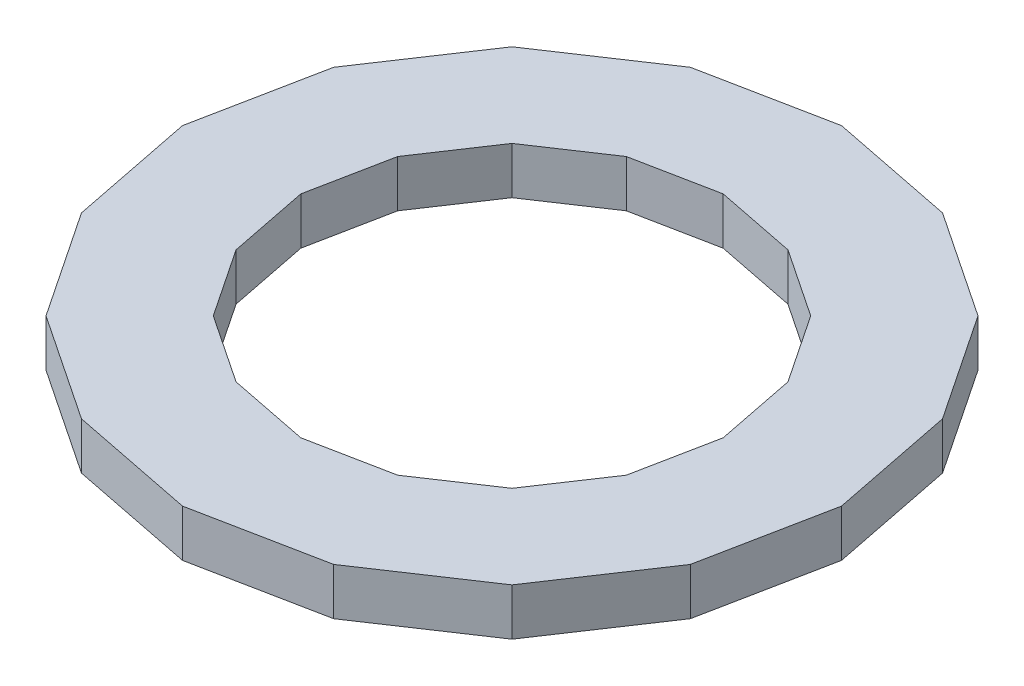
ISO-10303-21;
HEADER;
FILE_DESCRIPTION(('STEP AP214'),'2;1');
FILE_NAME('part.step','',(''),(''),'','','');
FILE_SCHEMA(('AUTOMOTIVE_DESIGN { 1 0 10303 214 1 1 1 1 }'));
ENDSEC;
DATA;
#1=APPLICATION_CONTEXT('core data for automotive mechanical design processes');
#2=APPLICATION_PROTOCOL_DEFINITION('international standard','automotive_design',2000,#1);
#3=PRODUCT_CONTEXT('',#1,'mechanical');
#4=PRODUCT('Part','Part','',(#3));
#5=PRODUCT_RELATED_PRODUCT_CATEGORY('part','',(#4));
#6=PRODUCT_DEFINITION_FORMATION('','',#4);
#7=PRODUCT_DEFINITION_CONTEXT('part definition',#1,'design');
#8=PRODUCT_DEFINITION('design','',#6,#7);
#9=PRODUCT_DEFINITION_SHAPE('','',#8);
#10=(LENGTH_UNIT() NAMED_UNIT(*) SI_UNIT(.MILLI.,.METRE.));
#11=(NAMED_UNIT(*) PLANE_ANGLE_UNIT() SI_UNIT($,.RADIAN.));
#12=(NAMED_UNIT(*) SI_UNIT($,.STERADIAN.) SOLID_ANGLE_UNIT());
#13=UNCERTAINTY_MEASURE_WITH_UNIT(LENGTH_MEASURE(1.E-05),#10,'distance_accuracy_value','');
#14=(GEOMETRIC_REPRESENTATION_CONTEXT(3) GLOBAL_UNCERTAINTY_ASSIGNED_CONTEXT((#13)) GLOBAL_UNIT_ASSIGNED_CONTEXT((#10,
#11,#12)) REPRESENTATION_CONTEXT('',''));
#15=CARTESIAN_POINT('',(0.,0.,0.));
#16=DIRECTION('',(0.,0.,1.));
#17=DIRECTION('',(1.,0.,0.));
#18=AXIS2_PLACEMENT_3D('',#15,#16,#17);
#19=CARTESIAN_POINT('',(0.,19.05,0.));
#20=DIRECTION('',(0.,1.,0.));
#21=DIRECTION('',(0.,0.,1.));
#22=AXIS2_PLACEMENT_3D('',#19,#20,#21);
#23=PLANE('',#22);
#24=DIRECTION('',(0.195090322016117,0.,-0.980785280403233));
#25=VECTOR('',#24,1.);
#26=CARTESIAN_POINT('',(123.292654296521,19.05,51.0694895505946));
#27=LINE('',#26,#25);
#28=CARTESIAN_POINT('',(123.292654296521,19.05,51.0694895505946));
#29=VERTEX_POINT('',#28);
#30=CARTESIAN_POINT('',(133.4510073639,19.05,-1.48838792591941E-12));
#31=VERTEX_POINT('',#30);
#32=EDGE_CURVE('E372',#29,#31,#27,.T.);
#33=ORIENTED_EDGE('',*,*,#32,.T.);
#34=DIRECTION('',(-0.19509032201614,0.,-0.980785280403228));
#35=VECTOR('',#34,1.);
#36=CARTESIAN_POINT('',(133.4510073639,19.05,-1.48838792591941E-12));
#37=LINE('',#36,#35);
#38=CARTESIAN_POINT('',(123.29265429652,19.05,-51.0694895505976));
#39=VERTEX_POINT('',#38);
#40=EDGE_CURVE('E375',#31,#39,#37,.T.);
#41=ORIENTED_EDGE('',*,*,#40,.T.);
#42=DIRECTION('',(-0.555570233019612,0.,-0.831469612302539));
#43=VECTOR('',#42,1.);
#44=CARTESIAN_POINT('',(123.29265429652,19.05,-51.0694895505976));
#45=LINE('',#44,#43);
#46=CARTESIAN_POINT('',(94.3641122631884,19.05,-94.3641122631908));
#47=VERTEX_POINT('',#46);
#48=EDGE_CURVE('E379',#39,#47,#45,.T.);
#49=ORIENTED_EDGE('',*,*,#48,.T.);
#50=DIRECTION('',(-0.831469612302552,0.,-0.555570233019592));
#51=VECTOR('',#50,1.);
#52=CARTESIAN_POINT('',(94.3641122631884,19.05,-94.3641122631908));
#53=LINE('',#52,#51);
#54=CARTESIAN_POINT('',(51.0694895505949,19.05,-123.292654296521));
#55=VERTEX_POINT('',#54);
#56=EDGE_CURVE('E382',#47,#55,#53,.T.);
#57=ORIENTED_EDGE('',*,*,#56,.T.);
#58=DIRECTION('',(-0.980785280403233,0.,-0.195090322016117));
#59=VECTOR('',#58,1.);
#60=CARTESIAN_POINT('',(51.0694895505949,19.05,-123.292654296521));
#61=LINE('',#60,#59);
#62=CARTESIAN_POINT('',(-1.63749649234883E-12,19.05,-133.4510073639));
#63=VERTEX_POINT('',#62);
#64=EDGE_CURVE('E384',#55,#63,#61,.T.);
#65=ORIENTED_EDGE('',*,*,#64,.T.);
#66=DIRECTION('',(-0.980785280403228,0.,0.19509032201614));
#67=VECTOR('',#66,1.);
#68=CARTESIAN_POINT('',(-1.63749649234883E-12,19.05,-133.4510073639));
#69=LINE('',#68,#67);
#70=CARTESIAN_POINT('',(-51.0694895505976,19.05,-123.29265429652));
#71=VERTEX_POINT('',#70);
#72=EDGE_CURVE('E386',#63,#71,#69,.T.);
#73=ORIENTED_EDGE('',*,*,#72,.T.);
#74=DIRECTION('',(-0.831469612302539,0.,0.555570233019612));
#75=VECTOR('',#74,1.);
#76=CARTESIAN_POINT('',(-51.0694895505976,19.05,-123.29265429652));
#77=LINE('',#76,#75);
#78=CARTESIAN_POINT('',(-94.3641122631907,19.05,-94.3641122631884));
#79=VERTEX_POINT('',#78);
#80=EDGE_CURVE('E388',#71,#79,#77,.T.);
#81=ORIENTED_EDGE('',*,*,#80,.T.);
#82=DIRECTION('',(-0.555570233019592,0.,0.831469612302552));
#83=VECTOR('',#82,1.);
#84=CARTESIAN_POINT('',(-94.3641122631907,19.05,-94.3641122631884));
#85=LINE('',#84,#83);
#86=CARTESIAN_POINT('',(-123.292654296521,19.05,-51.0694895505946));
#87=VERTEX_POINT('',#86);
#88=EDGE_CURVE('E390',#79,#87,#85,.T.);
#89=ORIENTED_EDGE('',*,*,#88,.T.);
#90=DIRECTION('',(-0.195090322016117,0.,0.980785280403233));
#91=VECTOR('',#90,1.);
#92=CARTESIAN_POINT('',(-123.292654296521,19.05,-51.0694895505946));
#93=LINE('',#92,#91);
#94=CARTESIAN_POINT('',(-133.4510073639,19.05,1.62428577440673E-12));
#95=VERTEX_POINT('',#94);
#96=EDGE_CURVE('E392',#87,#95,#93,.T.);
#97=ORIENTED_EDGE('',*,*,#96,.T.);
#98=DIRECTION('',(0.19509032201614,0.,0.980785280403228));
#99=VECTOR('',#98,1.);
#100=CARTESIAN_POINT('',(-133.4510073639,19.05,1.62428577440673E-12));
#101=LINE('',#100,#99);
#102=CARTESIAN_POINT('',(-123.29265429652,19.05,51.0694895505975));
#103=VERTEX_POINT('',#102);
#104=EDGE_CURVE('E394',#95,#103,#101,.T.);
#105=ORIENTED_EDGE('',*,*,#104,.T.);
#106=DIRECTION('',(0.555570233019612,0.,0.831469612302539));
#107=VECTOR('',#106,1.);
#108=CARTESIAN_POINT('',(-123.29265429652,19.05,51.0694895505975));
#109=LINE('',#108,#107);
#110=CARTESIAN_POINT('',(-94.3641122631884,19.05,94.3641122631907));
#111=VERTEX_POINT('',#110);
#112=EDGE_CURVE('E396',#103,#111,#109,.T.);
#113=ORIENTED_EDGE('',*,*,#112,.T.);
#114=DIRECTION('',(0.831469612302552,0.,0.555570233019592));
#115=VECTOR('',#114,1.);
#116=CARTESIAN_POINT('',(-94.3641122631884,19.05,94.3641122631907));
#117=LINE('',#116,#115);
#118=CARTESIAN_POINT('',(-51.0694895505946,19.05,123.292654296521));
#119=VERTEX_POINT('',#118);
#120=EDGE_CURVE('E398',#111,#119,#117,.T.);
#121=ORIENTED_EDGE('',*,*,#120,.T.);
#122=DIRECTION('',(0.980785280403233,0.,0.195090322016117));
#123=VECTOR('',#122,1.);
#124=CARTESIAN_POINT('',(-51.0694895505946,19.05,123.292654296521));
#125=LINE('',#124,#123);
#126=CARTESIAN_POINT('',(1.51394766675289E-12,19.05,133.4510073639));
#127=VERTEX_POINT('',#126);
#128=EDGE_CURVE('E400',#119,#127,#125,.T.);
#129=ORIENTED_EDGE('',*,*,#128,.T.);
#130=DIRECTION('',(0.980785280403228,0.,-0.19509032201614));
#131=VECTOR('',#130,1.);
#132=CARTESIAN_POINT('',(1.51394766675289E-12,19.05,133.4510073639));
#133=LINE('',#132,#131);
#134=CARTESIAN_POINT('',(51.0694895505976,19.05,123.29265429652));
#135=VERTEX_POINT('',#134);
#136=EDGE_CURVE('E402',#127,#135,#133,.T.);
#137=ORIENTED_EDGE('',*,*,#136,.T.);
#138=DIRECTION('',(0.831469612302539,0.,-0.555570233019612));
#139=VECTOR('',#138,1.);
#140=CARTESIAN_POINT('',(51.0694895505976,19.05,123.29265429652));
#141=LINE('',#140,#139);
#142=CARTESIAN_POINT('',(94.3641122631907,19.05,94.3641122631884));
#143=VERTEX_POINT('',#142);
#144=EDGE_CURVE('E404',#135,#143,#141,.T.);
#145=ORIENTED_EDGE('',*,*,#144,.T.);
#146=DIRECTION('',(0.555570233019593,0.,-0.831469612302552));
#147=VECTOR('',#146,1.);
#148=CARTESIAN_POINT('',(94.3641122631907,19.05,94.3641122631884));
#149=LINE('',#148,#147);
#150=EDGE_CURVE('E407',#143,#29,#149,.T.);
#151=ORIENTED_EDGE('',*,*,#150,.T.);
#152=EDGE_LOOP('',(#33,#41,#49,#57,#65,#73,#81,#89,#97,#105,#113,#121,#129,#137,#145,#151));
#153=FACE_BOUND('',#152,.T.);
#154=DIRECTION('',(-0.19509032201614,0.,-0.980785280403228));
#155=VECTOR('',#154,1.);
#156=CARTESIAN_POINT('',(85.5404188396911,19.05,-1.06158805616335E-12));
#157=LINE('',#156,#155);
#158=CARTESIAN_POINT('',(85.5404188396911,19.05,-1.06158805616335E-12));
#159=VERTEX_POINT('',#158);
#160=CARTESIAN_POINT('',(79.0290421684331,19.05,-32.7349010875213));
#161=VERTEX_POINT('',#160);
#162=EDGE_CURVE('E251',#159,#161,#157,.T.);
#163=ORIENTED_EDGE('',*,*,#162,.F.);
#164=DIRECTION('',(0.195090322016117,0.,-0.980785280403233));
#165=VECTOR('',#164,1.);
#166=CARTESIAN_POINT('',(79.0290421684339,19.05,32.7349010875194));
#167=LINE('',#166,#165);
#168=CARTESIAN_POINT('',(79.0290421684339,19.05,32.7349010875194));
#169=VERTEX_POINT('',#168);
#170=EDGE_CURVE('E243',#169,#159,#167,.T.);
#171=ORIENTED_EDGE('',*,*,#170,.F.);
#172=DIRECTION('',(0.555570233019593,0.,-0.831469612302552));
#173=VECTOR('',#172,1.);
#174=CARTESIAN_POINT('',(60.4862102270838,19.05,60.4862102270824));
#175=LINE('',#174,#173);
#176=CARTESIAN_POINT('',(60.4862102270838,19.05,60.4862102270824));
#177=VERTEX_POINT('',#176);
#178=EDGE_CURVE('E297',#177,#169,#175,.T.);
#179=ORIENTED_EDGE('',*,*,#178,.F.);
#180=DIRECTION('',(0.831469612302539,0.,-0.555570233019612));
#181=VECTOR('',#180,1.);
#182=CARTESIAN_POINT('',(32.7349010875213,19.05,79.0290421684331));
#183=LINE('',#182,#181);
#184=CARTESIAN_POINT('',(32.7349010875213,19.05,79.0290421684331));
#185=VERTEX_POINT('',#184);
#186=EDGE_CURVE('E294',#185,#177,#183,.T.);
#187=ORIENTED_EDGE('',*,*,#186,.F.);
#188=DIRECTION('',(0.980785280403228,0.,-0.19509032201614));
#189=VECTOR('',#188,1.);
#190=CARTESIAN_POINT('',(1.01627863446326E-12,19.05,85.5404188396911));
#191=LINE('',#190,#189);
#192=CARTESIAN_POINT('',(1.01627863446326E-12,19.05,85.5404188396911));
#193=VERTEX_POINT('',#192);
#194=EDGE_CURVE('E292',#193,#185,#191,.T.);
#195=ORIENTED_EDGE('',*,*,#194,.F.);
#196=DIRECTION('',(0.980785280403233,0.,0.195090322016117));
#197=VECTOR('',#196,1.);
#198=CARTESIAN_POINT('',(-32.7349010875195,19.05,79.0290421684338));
#199=LINE('',#198,#197);
#200=CARTESIAN_POINT('',(-32.7349010875195,19.05,79.0290421684338));
#201=VERTEX_POINT('',#200);
#202=EDGE_CURVE('E290',#201,#193,#199,.T.);
#203=ORIENTED_EDGE('',*,*,#202,.F.);
#204=DIRECTION('',(0.831469612302552,0.,0.555570233019593));
#205=VECTOR('',#204,1.);
#206=CARTESIAN_POINT('',(-60.4862102270824,19.05,60.4862102270838));
#207=LINE('',#206,#205);
#208=CARTESIAN_POINT('',(-60.4862102270824,19.05,60.4862102270838));
#209=VERTEX_POINT('',#208);
#210=EDGE_CURVE('E288',#209,#201,#207,.T.);
#211=ORIENTED_EDGE('',*,*,#210,.F.);
#212=DIRECTION('',(0.555570233019612,0.,0.831469612302538));
#213=VECTOR('',#212,1.);
#214=CARTESIAN_POINT('',(-79.0290421684331,19.05,32.7349010875213));
#215=LINE('',#214,#213);
#216=CARTESIAN_POINT('',(-79.0290421684331,19.05,32.7349010875213));
#217=VERTEX_POINT('',#216);
#218=EDGE_CURVE('E286',#217,#209,#215,.T.);
#219=ORIENTED_EDGE('',*,*,#218,.F.);
#220=DIRECTION('',(0.19509032201614,0.,0.980785280403228));
#221=VECTOR('',#220,1.);
#222=CARTESIAN_POINT('',(-85.5404188396911,19.05,1.03311122827834E-12));
#223=LINE('',#222,#221);
#224=CARTESIAN_POINT('',(-85.5404188396911,19.05,1.03311122827834E-12));
#225=VERTEX_POINT('',#224);
#226=EDGE_CURVE('E284',#225,#217,#223,.T.);
#227=ORIENTED_EDGE('',*,*,#226,.F.);
#228=DIRECTION('',(-0.195090322016117,0.,0.980785280403233));
#229=VECTOR('',#228,1.);
#230=CARTESIAN_POINT('',(-79.0290421684339,19.05,-32.7349010875194));
#231=LINE('',#230,#229);
#232=CARTESIAN_POINT('',(-79.0290421684339,19.05,-32.7349010875194));
#233=VERTEX_POINT('',#232);
#234=EDGE_CURVE('E282',#233,#225,#231,.T.);
#235=ORIENTED_EDGE('',*,*,#234,.F.);
#236=DIRECTION('',(-0.555570233019593,0.,0.831469612302552));
#237=VECTOR('',#236,1.);
#238=CARTESIAN_POINT('',(-60.4862102270838,19.05,-60.4862102270823));
#239=LINE('',#238,#237);
#240=CARTESIAN_POINT('',(-60.4862102270838,19.05,-60.4862102270823));
#241=VERTEX_POINT('',#240);
#242=EDGE_CURVE('E280',#241,#233,#239,.T.);
#243=ORIENTED_EDGE('',*,*,#242,.F.);
#244=DIRECTION('',(-0.831469612302539,0.,0.555570233019612));
#245=VECTOR('',#244,1.);
#246=CARTESIAN_POINT('',(-32.7349010875213,19.05,-79.0290421684331));
#247=LINE('',#246,#245);
#248=CARTESIAN_POINT('',(-32.7349010875213,19.05,-79.0290421684331));
#249=VERTEX_POINT('',#248);
#250=EDGE_CURVE('E278',#249,#241,#247,.T.);
#251=ORIENTED_EDGE('',*,*,#250,.F.);
#252=DIRECTION('',(-0.980785280403228,0.,0.19509032201614));
#253=VECTOR('',#252,1.);
#254=CARTESIAN_POINT('',(-1.01279089201621E-12,19.05,-85.5404188396911));
#255=LINE('',#254,#253);
#256=CARTESIAN_POINT('',(-1.01279089201621E-12,19.05,-85.5404188396911));
#257=VERTEX_POINT('',#256);
#258=EDGE_CURVE('E276',#257,#249,#255,.T.);
#259=ORIENTED_EDGE('',*,*,#258,.F.);
#260=DIRECTION('',(-0.980785280403233,0.,-0.195090322016117));
#261=VECTOR('',#260,1.);
#262=CARTESIAN_POINT('',(32.7349010875195,19.05,-79.0290421684338));
#263=LINE('',#262,#261);
#264=CARTESIAN_POINT('',(32.7349010875195,19.05,-79.0290421684338));
#265=VERTEX_POINT('',#264);
#266=EDGE_CURVE('E274',#265,#257,#263,.T.);
#267=ORIENTED_EDGE('',*,*,#266,.F.);
#268=DIRECTION('',(-0.831469612302552,0.,-0.555570233019592));
#269=VECTOR('',#268,1.);
#270=CARTESIAN_POINT('',(60.4862102270824,19.05,-60.4862102270838));
#271=LINE('',#270,#269);
#272=CARTESIAN_POINT('',(60.4862102270824,19.05,-60.4862102270838));
#273=VERTEX_POINT('',#272);
#274=EDGE_CURVE('E270',#273,#265,#271,.T.);
#275=ORIENTED_EDGE('',*,*,#274,.F.);
#276=DIRECTION('',(-0.555570233019612,0.,-0.831469612302539));
#277=VECTOR('',#276,1.);
#278=CARTESIAN_POINT('',(79.0290421684331,19.05,-32.7349010875213));
#279=LINE('',#278,#277);
#280=EDGE_CURVE('E264',#161,#273,#279,.T.);
#281=ORIENTED_EDGE('',*,*,#280,.F.);
#282=EDGE_LOOP('',(#163,#171,#179,#187,#195,#203,#211,#219,#227,#235,#243,#251,#259,#267,#275,#281));
#283=FACE_BOUND('',#282,.T.);
#284=ADVANCED_FACE('F34',(#153,#283),#23,.T.);
#285=CARTESIAN_POINT('',(0.,0.,0.));
#286=DIRECTION('',(0.,1.,0.));
#287=DIRECTION('',(0.,0.,1.));
#288=AXIS2_PLACEMENT_3D('',#285,#286,#287);
#289=PLANE('',#288);
#290=DIRECTION('',(0.195090322016117,0.,-0.980785280403233));
#291=VECTOR('',#290,1.);
#292=CARTESIAN_POINT('',(123.292654296521,0.,51.0694895505946));
#293=LINE('',#292,#291);
#294=CARTESIAN_POINT('',(123.292654296521,0.,51.0694895505946));
#295=VERTEX_POINT('',#294);
#296=CARTESIAN_POINT('',(133.4510073639,0.,-1.48838792591941E-12));
#297=VERTEX_POINT('',#296);
#298=EDGE_CURVE('E259',#295,#297,#293,.T.);
#299=ORIENTED_EDGE('',*,*,#298,.F.);
#300=DIRECTION('',(0.555570233019593,0.,-0.831469612302552));
#301=VECTOR('',#300,1.);
#302=CARTESIAN_POINT('',(94.3641122631907,0.,94.3641122631884));
#303=LINE('',#302,#301);
#304=CARTESIAN_POINT('',(94.3641122631907,0.,94.3641122631884));
#305=VERTEX_POINT('',#304);
#306=EDGE_CURVE('E376',#305,#295,#303,.T.);
#307=ORIENTED_EDGE('',*,*,#306,.F.);
#308=DIRECTION('',(0.831469612302539,0.,-0.555570233019612));
#309=VECTOR('',#308,1.);
#310=CARTESIAN_POINT('',(51.0694895505976,0.,123.29265429652));
#311=LINE('',#310,#309);
#312=CARTESIAN_POINT('',(51.0694895505976,0.,123.29265429652));
#313=VERTEX_POINT('',#312);
#314=EDGE_CURVE('E441',#313,#305,#311,.T.);
#315=ORIENTED_EDGE('',*,*,#314,.F.);
#316=DIRECTION('',(0.980785280403228,0.,-0.19509032201614));
#317=VECTOR('',#316,1.);
#318=CARTESIAN_POINT('',(1.51394766675289E-12,0.,133.4510073639));
#319=LINE('',#318,#317);
#320=CARTESIAN_POINT('',(1.51394766675289E-12,0.,133.4510073639));
#321=VERTEX_POINT('',#320);
#322=EDGE_CURVE('E439',#321,#313,#319,.T.);
#323=ORIENTED_EDGE('',*,*,#322,.F.);
#324=DIRECTION('',(0.980785280403233,0.,0.195090322016117));
#325=VECTOR('',#324,1.);
#326=CARTESIAN_POINT('',(-51.0694895505946,0.,123.292654296521));
#327=LINE('',#326,#325);
#328=CARTESIAN_POINT('',(-51.0694895505946,0.,123.292654296521));
#329=VERTEX_POINT('',#328);
#330=EDGE_CURVE('E436',#329,#321,#327,.T.);
#331=ORIENTED_EDGE('',*,*,#330,.F.);
#332=DIRECTION('',(0.831469612302552,0.,0.555570233019592));
#333=VECTOR('',#332,1.);
#334=CARTESIAN_POINT('',(-94.3641122631884,0.,94.3641122631907));
#335=LINE('',#334,#333);
#336=CARTESIAN_POINT('',(-94.3641122631884,0.,94.3641122631907));
#337=VERTEX_POINT('',#336);
#338=EDGE_CURVE('E433',#337,#329,#335,.T.);
#339=ORIENTED_EDGE('',*,*,#338,.F.);
#340=DIRECTION('',(0.555570233019612,0.,0.831469612302539));
#341=VECTOR('',#340,1.);
#342=CARTESIAN_POINT('',(-123.29265429652,0.,51.0694895505975));
#343=LINE('',#342,#341);
#344=CARTESIAN_POINT('',(-123.29265429652,0.,51.0694895505975));
#345=VERTEX_POINT('',#344);
#346=EDGE_CURVE('E431',#345,#337,#343,.T.);
#347=ORIENTED_EDGE('',*,*,#346,.F.);
#348=DIRECTION('',(0.19509032201614,0.,0.980785280403228));
#349=VECTOR('',#348,1.);
#350=CARTESIAN_POINT('',(-133.4510073639,0.,1.62428577440673E-12));
#351=LINE('',#350,#349);
#352=CARTESIAN_POINT('',(-133.4510073639,0.,1.62428577440673E-12));
#353=VERTEX_POINT('',#352);
#354=EDGE_CURVE('E429',#353,#345,#351,.T.);
#355=ORIENTED_EDGE('',*,*,#354,.F.);
#356=DIRECTION('',(-0.195090322016117,0.,0.980785280403233));
#357=VECTOR('',#356,1.);
#358=CARTESIAN_POINT('',(-123.292654296521,0.,-51.0694895505946));
#359=LINE('',#358,#357);
#360=CARTESIAN_POINT('',(-123.292654296521,0.,-51.0694895505946));
#361=VERTEX_POINT('',#360);
#362=EDGE_CURVE('E427',#361,#353,#359,.T.);
#363=ORIENTED_EDGE('',*,*,#362,.F.);
#364=DIRECTION('',(-0.555570233019592,0.,0.831469612302552));
#365=VECTOR('',#364,1.);
#366=CARTESIAN_POINT('',(-94.3641122631907,0.,-94.3641122631884));
#367=LINE('',#366,#365);
#368=CARTESIAN_POINT('',(-94.3641122631907,0.,-94.3641122631884));
#369=VERTEX_POINT('',#368);
#370=EDGE_CURVE('E425',#369,#361,#367,.T.);
#371=ORIENTED_EDGE('',*,*,#370,.F.);
#372=DIRECTION('',(-0.831469612302539,0.,0.555570233019612));
#373=VECTOR('',#372,1.);
#374=CARTESIAN_POINT('',(-51.0694895505976,0.,-123.29265429652));
#375=LINE('',#374,#373);
#376=CARTESIAN_POINT('',(-51.0694895505976,0.,-123.29265429652));
#377=VERTEX_POINT('',#376);
#378=EDGE_CURVE('E423',#377,#369,#375,.T.);
#379=ORIENTED_EDGE('',*,*,#378,.F.);
#380=DIRECTION('',(-0.980785280403228,0.,0.19509032201614));
#381=VECTOR('',#380,1.);
#382=CARTESIAN_POINT('',(-1.63749649234883E-12,0.,-133.4510073639));
#383=LINE('',#382,#381);
#384=CARTESIAN_POINT('',(-1.63749649234883E-12,0.,-133.4510073639));
#385=VERTEX_POINT('',#384);
#386=EDGE_CURVE('E421',#385,#377,#383,.T.);
#387=ORIENTED_EDGE('',*,*,#386,.F.);
#388=DIRECTION('',(-0.980785280403233,0.,-0.195090322016117));
#389=VECTOR('',#388,1.);
#390=CARTESIAN_POINT('',(51.0694895505949,0.,-123.292654296521));
#391=LINE('',#390,#389);
#392=CARTESIAN_POINT('',(51.0694895505949,0.,-123.292654296521));
#393=VERTEX_POINT('',#392);
#394=EDGE_CURVE('E419',#393,#385,#391,.T.);
#395=ORIENTED_EDGE('',*,*,#394,.F.);
#396=DIRECTION('',(-0.831469612302552,0.,-0.555570233019592));
#397=VECTOR('',#396,1.);
#398=CARTESIAN_POINT('',(94.3641122631884,0.,-94.3641122631908));
#399=LINE('',#398,#397);
#400=CARTESIAN_POINT('',(94.3641122631884,0.,-94.3641122631908));
#401=VERTEX_POINT('',#400);
#402=EDGE_CURVE('E417',#401,#393,#399,.T.);
#403=ORIENTED_EDGE('',*,*,#402,.F.);
#404=DIRECTION('',(-0.555570233019612,0.,-0.831469612302539));
#405=VECTOR('',#404,1.);
#406=CARTESIAN_POINT('',(123.29265429652,0.,-51.0694895505976));
#407=LINE('',#406,#405);
#408=CARTESIAN_POINT('',(123.29265429652,0.,-51.0694895505976));
#409=VERTEX_POINT('',#408);
#410=EDGE_CURVE('E414',#409,#401,#407,.T.);
#411=ORIENTED_EDGE('',*,*,#410,.F.);
#412=DIRECTION('',(-0.19509032201614,0.,-0.980785280403228));
#413=VECTOR('',#412,1.);
#414=CARTESIAN_POINT('',(133.4510073639,0.,-1.48838792591941E-12));
#415=LINE('',#414,#413);
#416=EDGE_CURVE('E412',#297,#409,#415,.T.);
#417=ORIENTED_EDGE('',*,*,#416,.F.);
#418=EDGE_LOOP('',(#299,#307,#315,#323,#331,#339,#347,#355,#363,#371,#379,#387,#395,#403,#411,#417));
#419=FACE_BOUND('',#418,.T.);
#420=DIRECTION('',(0.195090322016117,0.,-0.980785280403233));
#421=VECTOR('',#420,1.);
#422=CARTESIAN_POINT('',(79.0290421684339,0.,32.7349010875194));
#423=LINE('',#422,#421);
#424=CARTESIAN_POINT('',(79.0290421684339,0.,32.7349010875194));
#425=VERTEX_POINT('',#424);
#426=CARTESIAN_POINT('',(85.5404188396911,0.,-1.06158805616335E-12));
#427=VERTEX_POINT('',#426);
#428=EDGE_CURVE('E57',#425,#427,#423,.T.);
#429=ORIENTED_EDGE('',*,*,#428,.T.);
#430=DIRECTION('',(-0.19509032201614,0.,-0.980785280403228));
#431=VECTOR('',#430,1.);
#432=CARTESIAN_POINT('',(85.5404188396911,0.,-1.06158805616335E-12));
#433=LINE('',#432,#431);
#434=CARTESIAN_POINT('',(79.0290421684331,0.,-32.7349010875213));
#435=VERTEX_POINT('',#434);
#436=EDGE_CURVE('E258',#427,#435,#433,.T.);
#437=ORIENTED_EDGE('',*,*,#436,.T.);
#438=DIRECTION('',(-0.555570233019612,0.,-0.831469612302539));
#439=VECTOR('',#438,1.);
#440=CARTESIAN_POINT('',(79.0290421684331,0.,-32.7349010875213));
#441=LINE('',#440,#439);
#442=CARTESIAN_POINT('',(60.4862102270824,0.,-60.4862102270838));
#443=VERTEX_POINT('',#442);
#444=EDGE_CURVE('E301',#435,#443,#441,.T.);
#445=ORIENTED_EDGE('',*,*,#444,.T.);
#446=DIRECTION('',(-0.831469612302552,0.,-0.555570233019592));
#447=VECTOR('',#446,1.);
#448=CARTESIAN_POINT('',(60.4862102270824,0.,-60.4862102270838));
#449=LINE('',#448,#447);
#450=CARTESIAN_POINT('',(32.7349010875195,0.,-79.0290421684338));
#451=VERTEX_POINT('',#450);
#452=EDGE_CURVE('E304',#443,#451,#449,.T.);
#453=ORIENTED_EDGE('',*,*,#452,.T.);
#454=DIRECTION('',(-0.980785280403233,0.,-0.195090322016117));
#455=VECTOR('',#454,1.);
#456=CARTESIAN_POINT('',(32.7349010875195,0.,-79.0290421684338));
#457=LINE('',#456,#455);
#458=CARTESIAN_POINT('',(-1.01279089201621E-12,0.,-85.5404188396911));
#459=VERTEX_POINT('',#458);
#460=EDGE_CURVE('E307',#451,#459,#457,.T.);
#461=ORIENTED_EDGE('',*,*,#460,.T.);
#462=DIRECTION('',(-0.980785280403228,0.,0.19509032201614));
#463=VECTOR('',#462,1.);
#464=CARTESIAN_POINT('',(-1.01279089201621E-12,0.,-85.5404188396911));
#465=LINE('',#464,#463);
#466=CARTESIAN_POINT('',(-32.7349010875213,0.,-79.0290421684331));
#467=VERTEX_POINT('',#466);
#468=EDGE_CURVE('E310',#459,#467,#465,.T.);
#469=ORIENTED_EDGE('',*,*,#468,.T.);
#470=DIRECTION('',(-0.831469612302539,0.,0.555570233019612));
#471=VECTOR('',#470,1.);
#472=CARTESIAN_POINT('',(-32.7349010875213,0.,-79.0290421684331));
#473=LINE('',#472,#471);
#474=CARTESIAN_POINT('',(-60.4862102270838,0.,-60.4862102270823));
#475=VERTEX_POINT('',#474);
#476=EDGE_CURVE('E313',#467,#475,#473,.T.);
#477=ORIENTED_EDGE('',*,*,#476,.T.);
#478=DIRECTION('',(-0.555570233019593,0.,0.831469612302552));
#479=VECTOR('',#478,1.);
#480=CARTESIAN_POINT('',(-60.4862102270838,0.,-60.4862102270823));
#481=LINE('',#480,#479);
#482=CARTESIAN_POINT('',(-79.0290421684339,0.,-32.7349010875194));
#483=VERTEX_POINT('',#482);
#484=EDGE_CURVE('E316',#475,#483,#481,.T.);
#485=ORIENTED_EDGE('',*,*,#484,.T.);
#486=DIRECTION('',(-0.195090322016117,0.,0.980785280403233));
#487=VECTOR('',#486,1.);
#488=CARTESIAN_POINT('',(-79.0290421684339,0.,-32.7349010875194));
#489=LINE('',#488,#487);
#490=CARTESIAN_POINT('',(-85.5404188396911,0.,1.03311122827834E-12));
#491=VERTEX_POINT('',#490);
#492=EDGE_CURVE('E319',#483,#491,#489,.T.);
#493=ORIENTED_EDGE('',*,*,#492,.T.);
#494=DIRECTION('',(0.19509032201614,0.,0.980785280403228));
#495=VECTOR('',#494,1.);
#496=CARTESIAN_POINT('',(-85.5404188396911,0.,1.03311122827834E-12));
#497=LINE('',#496,#495);
#498=CARTESIAN_POINT('',(-79.0290421684331,0.,32.7349010875213));
#499=VERTEX_POINT('',#498);
#500=EDGE_CURVE('E322',#491,#499,#497,.T.);
#501=ORIENTED_EDGE('',*,*,#500,.T.);
#502=DIRECTION('',(0.555570233019612,0.,0.831469612302538));
#503=VECTOR('',#502,1.);
#504=CARTESIAN_POINT('',(-79.0290421684331,0.,32.7349010875213));
#505=LINE('',#504,#503);
#506=CARTESIAN_POINT('',(-60.4862102270824,0.,60.4862102270838));
#507=VERTEX_POINT('',#506);
#508=EDGE_CURVE('E325',#499,#507,#505,.T.);
#509=ORIENTED_EDGE('',*,*,#508,.T.);
#510=DIRECTION('',(0.831469612302552,0.,0.555570233019593));
#511=VECTOR('',#510,1.);
#512=CARTESIAN_POINT('',(-60.4862102270824,0.,60.4862102270838));
#513=LINE('',#512,#511);
#514=CARTESIAN_POINT('',(-32.7349010875195,0.,79.0290421684338));
#515=VERTEX_POINT('',#514);
#516=EDGE_CURVE('E329',#507,#515,#513,.T.);
#517=ORIENTED_EDGE('',*,*,#516,.T.);
#518=DIRECTION('',(0.980785280403233,0.,0.195090322016117));
#519=VECTOR('',#518,1.);
#520=CARTESIAN_POINT('',(-32.7349010875195,0.,79.0290421684338));
#521=LINE('',#520,#519);
#522=CARTESIAN_POINT('',(1.01627863446326E-12,0.,85.5404188396911));
#523=VERTEX_POINT('',#522);
#524=EDGE_CURVE('E332',#515,#523,#521,.T.);
#525=ORIENTED_EDGE('',*,*,#524,.T.);
#526=DIRECTION('',(0.980785280403228,0.,-0.19509032201614));
#527=VECTOR('',#526,1.);
#528=CARTESIAN_POINT('',(1.01627863446326E-12,0.,85.5404188396911));
#529=LINE('',#528,#527);
#530=CARTESIAN_POINT('',(32.7349010875213,0.,79.0290421684331));
#531=VERTEX_POINT('',#530);
#532=EDGE_CURVE('E335',#523,#531,#529,.T.);
#533=ORIENTED_EDGE('',*,*,#532,.T.);
#534=DIRECTION('',(0.831469612302539,0.,-0.555570233019612));
#535=VECTOR('',#534,1.);
#536=CARTESIAN_POINT('',(32.7349010875213,0.,79.0290421684331));
#537=LINE('',#536,#535);
#538=CARTESIAN_POINT('',(60.4862102270838,0.,60.4862102270824));
#539=VERTEX_POINT('',#538);
#540=EDGE_CURVE('E338',#531,#539,#537,.T.);
#541=ORIENTED_EDGE('',*,*,#540,.T.);
#542=DIRECTION('',(0.555570233019593,0.,-0.831469612302552));
#543=VECTOR('',#542,1.);
#544=CARTESIAN_POINT('',(60.4862102270838,0.,60.4862102270824));
#545=LINE('',#544,#543);
#546=EDGE_CURVE('E252',#539,#425,#545,.T.);
#547=ORIENTED_EDGE('',*,*,#546,.T.);
#548=EDGE_LOOP('',(#429,#437,#445,#453,#461,#469,#477,#485,#493,#501,#509,#517,#525,#533,#541,#547));
#549=FACE_BOUND('',#548,.T.);
#550=ADVANCED_FACE('F500',(#419,#549),#289,.F.);
#551=CARTESIAN_POINT('',(123.292654296521,19.05,51.0694895505946));
#552=DIRECTION('',(-0.980785280403233,0.,-0.195090322016117));
#553=DIRECTION('',(-0.195090322016117,0.,0.980785280403233));
#554=AXIS2_PLACEMENT_3D('',#551,#552,#553);
#555=PLANE('',#554);
#556=ORIENTED_EDGE('',*,*,#298,.T.);
#557=DIRECTION('',(0.,-1.,0.));
#558=VECTOR('',#557,1.);
#559=CARTESIAN_POINT('',(133.4510073639,19.05,-1.48838792591941E-12));
#560=LINE('',#559,#558);
#561=EDGE_CURVE('E11',#31,#297,#560,.T.);
#562=ORIENTED_EDGE('',*,*,#561,.F.);
#563=ORIENTED_EDGE('',*,*,#32,.F.);
#564=DIRECTION('',(0.,-1.,0.));
#565=VECTOR('',#564,1.);
#566=CARTESIAN_POINT('',(123.292654296521,19.05,51.0694895505946));
#567=LINE('',#566,#565);
#568=EDGE_CURVE('E409',#29,#295,#567,.T.);
#569=ORIENTED_EDGE('',*,*,#568,.T.);
#570=EDGE_LOOP('',(#556,#562,#563,#569));
#571=FACE_BOUND('',#570,.T.);
#572=ADVANCED_FACE('F36',(#571),#555,.F.);
#573=CARTESIAN_POINT('',(133.4510073639,19.05,-1.48838792591941E-12));
#574=DIRECTION('',(-0.980785280403228,0.,0.19509032201614));
#575=DIRECTION('',(0.19509032201614,0.,0.980785280403228));
#576=AXIS2_PLACEMENT_3D('',#573,#574,#575);
#577=PLANE('',#576);
#578=ORIENTED_EDGE('',*,*,#416,.T.);
#579=DIRECTION('',(0.,-1.,0.));
#580=VECTOR('',#579,1.);
#581=CARTESIAN_POINT('',(123.29265429652,19.05,-51.0694895505976));
#582=LINE('',#581,#580);
#583=EDGE_CURVE('E42',#39,#409,#582,.T.);
#584=ORIENTED_EDGE('',*,*,#583,.F.);
#585=ORIENTED_EDGE('',*,*,#40,.F.);
#586=ORIENTED_EDGE('',*,*,#561,.T.);
#587=EDGE_LOOP('',(#578,#584,#585,#586));
#588=FACE_BOUND('',#587,.T.);
#589=ADVANCED_FACE('F517',(#588),#577,.F.);
#590=CARTESIAN_POINT('',(123.29265429652,19.05,-51.0694895505976));
#591=DIRECTION('',(-0.831469612302539,0.,0.555570233019612));
#592=DIRECTION('',(0.555570233019612,0.,0.831469612302539));
#593=AXIS2_PLACEMENT_3D('',#590,#591,#592);
#594=PLANE('',#593);
#595=ORIENTED_EDGE('',*,*,#410,.T.);
#596=DIRECTION('',(0.,-1.,0.));
#597=VECTOR('',#596,1.);
#598=CARTESIAN_POINT('',(94.3641122631884,19.05,-94.3641122631908));
#599=LINE('',#598,#597);
#600=EDGE_CURVE('E485',#47,#401,#599,.T.);
#601=ORIENTED_EDGE('',*,*,#600,.F.);
#602=ORIENTED_EDGE('',*,*,#48,.F.);
#603=ORIENTED_EDGE('',*,*,#583,.T.);
#604=EDGE_LOOP('',(#595,#601,#602,#603));
#605=FACE_BOUND('',#604,.T.);
#606=ADVANCED_FACE('F494',(#605),#594,.F.);
#607=CARTESIAN_POINT('',(94.3641122631884,19.05,-94.3641122631908));
#608=DIRECTION('',(-0.555570233019592,0.,0.831469612302552));
#609=DIRECTION('',(0.831469612302552,0.,0.555570233019592));
#610=AXIS2_PLACEMENT_3D('',#607,#608,#609);
#611=PLANE('',#610);
#612=ORIENTED_EDGE('',*,*,#402,.T.);
#613=DIRECTION('',(0.,-1.,0.));
#614=VECTOR('',#613,1.);
#615=CARTESIAN_POINT('',(51.0694895505949,19.05,-123.292654296521));
#616=LINE('',#615,#614);
#617=EDGE_CURVE('E482',#55,#393,#616,.T.);
#618=ORIENTED_EDGE('',*,*,#617,.F.);
#619=ORIENTED_EDGE('',*,*,#56,.F.);
#620=ORIENTED_EDGE('',*,*,#600,.T.);
#621=EDGE_LOOP('',(#612,#618,#619,#620));
#622=FACE_BOUND('',#621,.T.);
#623=ADVANCED_FACE('F506',(#622),#611,.F.);
#624=CARTESIAN_POINT('',(51.0694895505949,19.05,-123.292654296521));
#625=DIRECTION('',(-0.195090322016116,0.,0.980785280403233));
#626=DIRECTION('',(0.980785280403233,0.,0.195090322016116));
#627=AXIS2_PLACEMENT_3D('',#624,#625,#626);
#628=PLANE('',#627);
#629=ORIENTED_EDGE('',*,*,#394,.T.);
#630=DIRECTION('',(0.,-1.,0.));
#631=VECTOR('',#630,1.);
#632=CARTESIAN_POINT('',(-1.63749649234883E-12,19.05,-133.4510073639));
#633=LINE('',#632,#631);
#634=EDGE_CURVE('E479',#63,#385,#633,.T.);
#635=ORIENTED_EDGE('',*,*,#634,.F.);
#636=ORIENTED_EDGE('',*,*,#64,.F.);
#637=ORIENTED_EDGE('',*,*,#617,.T.);
#638=EDGE_LOOP('',(#629,#635,#636,#637));
#639=FACE_BOUND('',#638,.T.);
#640=ADVANCED_FACE('F510',(#639),#628,.F.);
#641=CARTESIAN_POINT('',(-1.63749649234883E-12,19.05,-133.4510073639));
#642=DIRECTION('',(0.19509032201614,0.,0.980785280403228));
#643=DIRECTION('',(0.980785280403228,0.,-0.19509032201614));
#644=AXIS2_PLACEMENT_3D('',#641,#642,#643);
#645=PLANE('',#644);
#646=ORIENTED_EDGE('',*,*,#386,.T.);
#647=DIRECTION('',(0.,-1.,0.));
#648=VECTOR('',#647,1.);
#649=CARTESIAN_POINT('',(-51.0694895505976,19.05,-123.29265429652));
#650=LINE('',#649,#648);
#651=EDGE_CURVE('E475',#71,#377,#650,.T.);
#652=ORIENTED_EDGE('',*,*,#651,.F.);
#653=ORIENTED_EDGE('',*,*,#72,.F.);
#654=ORIENTED_EDGE('',*,*,#634,.T.);
#655=EDGE_LOOP('',(#646,#652,#653,#654));
#656=FACE_BOUND('',#655,.T.);
#657=ADVANCED_FACE('F570',(#656),#645,.F.);
#658=CARTESIAN_POINT('',(-51.0694895505976,19.05,-123.29265429652));
#659=DIRECTION('',(0.555570233019612,0.,0.831469612302539));
#660=DIRECTION('',(0.831469612302539,0.,-0.555570233019612));
#661=AXIS2_PLACEMENT_3D('',#658,#659,#660);
#662=PLANE('',#661);
#663=ORIENTED_EDGE('',*,*,#378,.T.);
#664=DIRECTION('',(0.,-1.,0.));
#665=VECTOR('',#664,1.);
#666=CARTESIAN_POINT('',(-94.3641122631907,19.05,-94.3641122631884));
#667=LINE('',#666,#665);
#668=EDGE_CURVE('E472',#79,#369,#667,.T.);
#669=ORIENTED_EDGE('',*,*,#668,.F.);
#670=ORIENTED_EDGE('',*,*,#80,.F.);
#671=ORIENTED_EDGE('',*,*,#651,.T.);
#672=EDGE_LOOP('',(#663,#669,#670,#671));
#673=FACE_BOUND('',#672,.T.);
#674=ADVANCED_FACE('F567',(#673),#662,.F.);
#675=CARTESIAN_POINT('',(-94.3641122631907,19.05,-94.3641122631884));
#676=DIRECTION('',(0.831469612302552,0.,0.555570233019592));
#677=DIRECTION('',(0.555570233019592,0.,-0.831469612302552));
#678=AXIS2_PLACEMENT_3D('',#675,#676,#677);
#679=PLANE('',#678);
#680=ORIENTED_EDGE('',*,*,#370,.T.);
#681=DIRECTION('',(0.,-1.,0.));
#682=VECTOR('',#681,1.);
#683=CARTESIAN_POINT('',(-123.292654296521,19.05,-51.0694895505946));
#684=LINE('',#683,#682);
#685=EDGE_CURVE('E469',#87,#361,#684,.T.);
#686=ORIENTED_EDGE('',*,*,#685,.F.);
#687=ORIENTED_EDGE('',*,*,#88,.F.);
#688=ORIENTED_EDGE('',*,*,#668,.T.);
#689=EDGE_LOOP('',(#680,#686,#687,#688));
#690=FACE_BOUND('',#689,.T.);
#691=ADVANCED_FACE('F563',(#690),#679,.F.);
#692=CARTESIAN_POINT('',(-123.292654296521,19.05,-51.0694895505946));
#693=DIRECTION('',(0.980785280403233,0.,0.195090322016117));
#694=DIRECTION('',(0.195090322016117,0.,-0.980785280403233));
#695=AXIS2_PLACEMENT_3D('',#692,#693,#694);
#696=PLANE('',#695);
#697=ORIENTED_EDGE('',*,*,#362,.T.);
#698=DIRECTION('',(0.,-1.,0.));
#699=VECTOR('',#698,1.);
#700=CARTESIAN_POINT('',(-133.4510073639,19.05,1.62428577440673E-12));
#701=LINE('',#700,#699);
#702=EDGE_CURVE('E466',#95,#353,#701,.T.);
#703=ORIENTED_EDGE('',*,*,#702,.F.);
#704=ORIENTED_EDGE('',*,*,#96,.F.);
#705=ORIENTED_EDGE('',*,*,#685,.T.);
#706=EDGE_LOOP('',(#697,#703,#704,#705));
#707=FACE_BOUND('',#706,.T.);
#708=ADVANCED_FACE('F559',(#707),#696,.F.);
#709=CARTESIAN_POINT('',(-133.4510073639,19.05,1.62428577440673E-12));
#710=DIRECTION('',(0.980785280403228,0.,-0.19509032201614));
#711=DIRECTION('',(-0.19509032201614,0.,-0.980785280403228));
#712=AXIS2_PLACEMENT_3D('',#709,#710,#711);
#713=PLANE('',#712);
#714=ORIENTED_EDGE('',*,*,#354,.T.);
#715=DIRECTION('',(0.,-1.,0.));
#716=VECTOR('',#715,1.);
#717=CARTESIAN_POINT('',(-123.29265429652,19.05,51.0694895505975));
#718=LINE('',#717,#716);
#719=EDGE_CURVE('E463',#103,#345,#718,.T.);
#720=ORIENTED_EDGE('',*,*,#719,.F.);
#721=ORIENTED_EDGE('',*,*,#104,.F.);
#722=ORIENTED_EDGE('',*,*,#702,.T.);
#723=EDGE_LOOP('',(#714,#720,#721,#722));
#724=FACE_BOUND('',#723,.T.);
#725=ADVANCED_FACE('F554',(#724),#713,.F.);
#726=CARTESIAN_POINT('',(-123.29265429652,19.05,51.0694895505975));
#727=DIRECTION('',(0.831469612302539,0.,-0.555570233019612));
#728=DIRECTION('',(-0.555570233019612,0.,-0.831469612302539));
#729=AXIS2_PLACEMENT_3D('',#726,#727,#728);
#730=PLANE('',#729);
#731=ORIENTED_EDGE('',*,*,#346,.T.);
#732=DIRECTION('',(0.,-1.,0.));
#733=VECTOR('',#732,1.);
#734=CARTESIAN_POINT('',(-94.3641122631884,19.05,94.3641122631907));
#735=LINE('',#734,#733);
#736=EDGE_CURVE('E460',#111,#337,#735,.T.);
#737=ORIENTED_EDGE('',*,*,#736,.F.);
#738=ORIENTED_EDGE('',*,*,#112,.F.);
#739=ORIENTED_EDGE('',*,*,#719,.T.);
#740=EDGE_LOOP('',(#731,#737,#738,#739));
#741=FACE_BOUND('',#740,.T.);
#742=ADVANCED_FACE('F548',(#741),#730,.F.);
#743=CARTESIAN_POINT('',(-94.3641122631884,19.05,94.3641122631907));
#744=DIRECTION('',(0.555570233019592,0.,-0.831469612302552));
#745=DIRECTION('',(-0.831469612302552,0.,-0.555570233019592));
#746=AXIS2_PLACEMENT_3D('',#743,#744,#745);
#747=PLANE('',#746);
#748=ORIENTED_EDGE('',*,*,#338,.T.);
#749=DIRECTION('',(0.,-1.,0.));
#750=VECTOR('',#749,1.);
#751=CARTESIAN_POINT('',(-51.0694895505946,19.05,123.292654296521));
#752=LINE('',#751,#750);
#753=EDGE_CURVE('E457',#119,#329,#752,.T.);
#754=ORIENTED_EDGE('',*,*,#753,.F.);
#755=ORIENTED_EDGE('',*,*,#120,.F.);
#756=ORIENTED_EDGE('',*,*,#736,.T.);
#757=EDGE_LOOP('',(#748,#754,#755,#756));
#758=FACE_BOUND('',#757,.T.);
#759=ADVANCED_FACE('F544',(#758),#747,.F.);
#760=CARTESIAN_POINT('',(-51.0694895505946,19.05,123.292654296521));
#761=DIRECTION('',(0.195090322016117,0.,-0.980785280403233));
#762=DIRECTION('',(-0.980785280403233,0.,-0.195090322016117));
#763=AXIS2_PLACEMENT_3D('',#760,#761,#762);
#764=PLANE('',#763);
#765=ORIENTED_EDGE('',*,*,#330,.T.);
#766=DIRECTION('',(0.,-1.,0.));
#767=VECTOR('',#766,1.);
#768=CARTESIAN_POINT('',(1.51394766675289E-12,19.05,133.4510073639));
#769=LINE('',#768,#767);
#770=EDGE_CURVE('E454',#127,#321,#769,.T.);
#771=ORIENTED_EDGE('',*,*,#770,.F.);
#772=ORIENTED_EDGE('',*,*,#128,.F.);
#773=ORIENTED_EDGE('',*,*,#753,.T.);
#774=EDGE_LOOP('',(#765,#771,#772,#773));
#775=FACE_BOUND('',#774,.T.);
#776=ADVANCED_FACE('F539',(#775),#764,.F.);
#777=CARTESIAN_POINT('',(1.51394766675289E-12,19.05,133.4510073639));
#778=DIRECTION('',(-0.19509032201614,0.,-0.980785280403228));
#779=DIRECTION('',(-0.980785280403228,0.,0.19509032201614));
#780=AXIS2_PLACEMENT_3D('',#777,#778,#779);
#781=PLANE('',#780);
#782=ORIENTED_EDGE('',*,*,#322,.T.);
#783=DIRECTION('',(0.,-1.,0.));
#784=VECTOR('',#783,1.);
#785=CARTESIAN_POINT('',(51.0694895505976,19.05,123.29265429652));
#786=LINE('',#785,#784);
#787=EDGE_CURVE('E451',#135,#313,#786,.T.);
#788=ORIENTED_EDGE('',*,*,#787,.F.);
#789=ORIENTED_EDGE('',*,*,#136,.F.);
#790=ORIENTED_EDGE('',*,*,#770,.T.);
#791=EDGE_LOOP('',(#782,#788,#789,#790));
#792=FACE_BOUND('',#791,.T.);
#793=ADVANCED_FACE('F533',(#792),#781,.F.);
#794=CARTESIAN_POINT('',(51.0694895505976,19.05,123.29265429652));
#795=DIRECTION('',(-0.555570233019612,0.,-0.831469612302539));
#796=DIRECTION('',(-0.831469612302539,0.,0.555570233019612));
#797=AXIS2_PLACEMENT_3D('',#794,#795,#796);
#798=PLANE('',#797);
#799=ORIENTED_EDGE('',*,*,#314,.T.);
#800=DIRECTION('',(0.,-1.,0.));
#801=VECTOR('',#800,1.);
#802=CARTESIAN_POINT('',(94.3641122631907,19.05,94.3641122631884));
#803=LINE('',#802,#801);
#804=EDGE_CURVE('E448',#143,#305,#803,.T.);
#805=ORIENTED_EDGE('',*,*,#804,.F.);
#806=ORIENTED_EDGE('',*,*,#144,.F.);
#807=ORIENTED_EDGE('',*,*,#787,.T.);
#808=EDGE_LOOP('',(#799,#805,#806,#807));
#809=FACE_BOUND('',#808,.T.);
#810=ADVANCED_FACE('F529',(#809),#798,.F.);
#811=CARTESIAN_POINT('',(94.3641122631907,19.05,94.3641122631884));
#812=DIRECTION('',(-0.831469612302552,0.,-0.555570233019592));
#813=DIRECTION('',(-0.555570233019593,0.,0.831469612302552));
#814=AXIS2_PLACEMENT_3D('',#811,#812,#813);
#815=PLANE('',#814);
#816=ORIENTED_EDGE('',*,*,#306,.T.);
#817=ORIENTED_EDGE('',*,*,#568,.F.);
#818=ORIENTED_EDGE('',*,*,#150,.F.);
#819=ORIENTED_EDGE('',*,*,#804,.T.);
#820=EDGE_LOOP('',(#816,#817,#818,#819));
#821=FACE_BOUND('',#820,.T.);
#822=ADVANCED_FACE('F524',(#821),#815,.F.);
#823=CARTESIAN_POINT('',(79.0290421684339,19.05,32.7349010875194));
#824=DIRECTION('',(-0.980785280403233,0.,-0.195090322016117));
#825=DIRECTION('',(-0.195090322016117,0.,0.980785280403233));
#826=AXIS2_PLACEMENT_3D('',#823,#824,#825);
#827=PLANE('',#826);
#828=ORIENTED_EDGE('',*,*,#428,.F.);
#829=DIRECTION('',(0.,-1.,0.));
#830=VECTOR('',#829,1.);
#831=CARTESIAN_POINT('',(79.0290421684339,19.05,32.7349010875194));
#832=LINE('',#831,#830);
#833=EDGE_CURVE('E247',#169,#425,#832,.T.);
#834=ORIENTED_EDGE('',*,*,#833,.F.);
#835=ORIENTED_EDGE('',*,*,#170,.T.);
#836=DIRECTION('',(0.,-1.,0.));
#837=VECTOR('',#836,1.);
#838=CARTESIAN_POINT('',(85.5404188396911,19.05,-1.06158805616335E-12));
#839=LINE('',#838,#837);
#840=EDGE_CURVE('E246',#159,#427,#839,.T.);
#841=ORIENTED_EDGE('',*,*,#840,.T.);
#842=EDGE_LOOP('',(#828,#834,#835,#841));
#843=FACE_BOUND('',#842,.T.);
#844=ADVANCED_FACE('F245',(#843),#827,.T.);
#845=CARTESIAN_POINT('',(85.5404188396911,19.05,-1.06158805616335E-12));
#846=DIRECTION('',(-0.980785280403228,0.,0.19509032201614));
#847=DIRECTION('',(0.19509032201614,0.,0.980785280403228));
#848=AXIS2_PLACEMENT_3D('',#845,#846,#847);
#849=PLANE('',#848);
#850=ORIENTED_EDGE('',*,*,#436,.F.);
#851=ORIENTED_EDGE('',*,*,#840,.F.);
#852=ORIENTED_EDGE('',*,*,#162,.T.);
#853=DIRECTION('',(0.,-1.,0.));
#854=VECTOR('',#853,1.);
#855=CARTESIAN_POINT('',(79.0290421684331,19.05,-32.7349010875213));
#856=LINE('',#855,#854);
#857=EDGE_CURVE('E260',#161,#435,#856,.T.);
#858=ORIENTED_EDGE('',*,*,#857,.T.);
#859=EDGE_LOOP('',(#850,#851,#852,#858));
#860=FACE_BOUND('',#859,.T.);
#861=ADVANCED_FACE('F255',(#860),#849,.T.);
#862=CARTESIAN_POINT('',(79.0290421684331,19.05,-32.7349010875213));
#863=DIRECTION('',(-0.831469612302539,0.,0.555570233019612));
#864=DIRECTION('',(0.555570233019612,0.,0.831469612302539));
#865=AXIS2_PLACEMENT_3D('',#862,#863,#864);
#866=PLANE('',#865);
#867=ORIENTED_EDGE('',*,*,#444,.F.);
#868=ORIENTED_EDGE('',*,*,#857,.F.);
#869=ORIENTED_EDGE('',*,*,#280,.T.);
#870=DIRECTION('',(0.,-1.,0.));
#871=VECTOR('',#870,1.);
#872=CARTESIAN_POINT('',(60.4862102270824,19.05,-60.4862102270838));
#873=LINE('',#872,#871);
#874=EDGE_CURVE('E368',#273,#443,#873,.T.);
#875=ORIENTED_EDGE('',*,*,#874,.T.);
#876=EDGE_LOOP('',(#867,#868,#869,#875));
#877=FACE_BOUND('',#876,.T.);
#878=ADVANCED_FACE('F652',(#877),#866,.T.);
#879=CARTESIAN_POINT('',(60.4862102270824,19.05,-60.4862102270838));
#880=DIRECTION('',(-0.555570233019592,0.,0.831469612302552));
#881=DIRECTION('',(0.831469612302552,0.,0.555570233019592));
#882=AXIS2_PLACEMENT_3D('',#879,#880,#881);
#883=PLANE('',#882);
#884=ORIENTED_EDGE('',*,*,#452,.F.);
#885=ORIENTED_EDGE('',*,*,#874,.F.);
#886=ORIENTED_EDGE('',*,*,#274,.T.);
#887=DIRECTION('',(0.,-1.,0.));
#888=VECTOR('',#887,1.);
#889=CARTESIAN_POINT('',(32.7349010875195,19.05,-79.0290421684338));
#890=LINE('',#889,#888);
#891=EDGE_CURVE('E366',#265,#451,#890,.T.);
#892=ORIENTED_EDGE('',*,*,#891,.T.);
#893=EDGE_LOOP('',(#884,#885,#886,#892));
#894=FACE_BOUND('',#893,.T.);
#895=ADVANCED_FACE('F658',(#894),#883,.T.);
#896=CARTESIAN_POINT('',(32.7349010875195,19.05,-79.0290421684338));
#897=DIRECTION('',(-0.195090322016117,0.,0.980785280403233));
#898=DIRECTION('',(0.980785280403233,0.,0.195090322016117));
#899=AXIS2_PLACEMENT_3D('',#896,#897,#898);
#900=PLANE('',#899);
#901=ORIENTED_EDGE('',*,*,#460,.F.);
#902=ORIENTED_EDGE('',*,*,#891,.F.);
#903=ORIENTED_EDGE('',*,*,#266,.T.);
#904=DIRECTION('',(0.,-1.,0.));
#905=VECTOR('',#904,1.);
#906=CARTESIAN_POINT('',(-1.01279089201621E-12,19.05,-85.5404188396911));
#907=LINE('',#906,#905);
#908=EDGE_CURVE('E364',#257,#459,#907,.T.);
#909=ORIENTED_EDGE('',*,*,#908,.T.);
#910=EDGE_LOOP('',(#901,#902,#903,#909));
#911=FACE_BOUND('',#910,.T.);
#912=ADVANCED_FACE('F666',(#911),#900,.T.);
#913=CARTESIAN_POINT('',(-1.01279089201621E-12,19.05,-85.5404188396911));
#914=DIRECTION('',(0.19509032201614,0.,0.980785280403228));
#915=DIRECTION('',(0.980785280403228,0.,-0.19509032201614));
#916=AXIS2_PLACEMENT_3D('',#913,#914,#915);
#917=PLANE('',#916);
#918=ORIENTED_EDGE('',*,*,#468,.F.);
#919=ORIENTED_EDGE('',*,*,#908,.F.);
#920=ORIENTED_EDGE('',*,*,#258,.T.);
#921=DIRECTION('',(0.,-1.,0.));
#922=VECTOR('',#921,1.);
#923=CARTESIAN_POINT('',(-32.7349010875213,19.05,-79.0290421684331));
#924=LINE('',#923,#922);
#925=EDGE_CURVE('E362',#249,#467,#924,.T.);
#926=ORIENTED_EDGE('',*,*,#925,.T.);
#927=EDGE_LOOP('',(#918,#919,#920,#926));
#928=FACE_BOUND('',#927,.T.);
#929=ADVANCED_FACE('F674',(#928),#917,.T.);
#930=CARTESIAN_POINT('',(-32.7349010875213,19.05,-79.0290421684331));
#931=DIRECTION('',(0.555570233019612,0.,0.831469612302539));
#932=DIRECTION('',(0.831469612302539,0.,-0.555570233019612));
#933=AXIS2_PLACEMENT_3D('',#930,#931,#932);
#934=PLANE('',#933);
#935=ORIENTED_EDGE('',*,*,#476,.F.);
#936=ORIENTED_EDGE('',*,*,#925,.F.);
#937=ORIENTED_EDGE('',*,*,#250,.T.);
#938=DIRECTION('',(0.,-1.,0.));
#939=VECTOR('',#938,1.);
#940=CARTESIAN_POINT('',(-60.4862102270838,19.05,-60.4862102270823));
#941=LINE('',#940,#939);
#942=EDGE_CURVE('E360',#241,#475,#941,.T.);
#943=ORIENTED_EDGE('',*,*,#942,.T.);
#944=EDGE_LOOP('',(#935,#936,#937,#943));
#945=FACE_BOUND('',#944,.T.);
#946=ADVANCED_FACE('F682',(#945),#934,.T.);
#947=CARTESIAN_POINT('',(-60.4862102270838,19.05,-60.4862102270823));
#948=DIRECTION('',(0.831469612302552,0.,0.555570233019593));
#949=DIRECTION('',(0.555570233019593,0.,-0.831469612302552));
#950=AXIS2_PLACEMENT_3D('',#947,#948,#949);
#951=PLANE('',#950);
#952=ORIENTED_EDGE('',*,*,#484,.F.);
#953=ORIENTED_EDGE('',*,*,#942,.F.);
#954=ORIENTED_EDGE('',*,*,#242,.T.);
#955=DIRECTION('',(0.,-1.,0.));
#956=VECTOR('',#955,1.);
#957=CARTESIAN_POINT('',(-79.0290421684339,19.05,-32.7349010875194));
#958=LINE('',#957,#956);
#959=EDGE_CURVE('E358',#233,#483,#958,.T.);
#960=ORIENTED_EDGE('',*,*,#959,.T.);
#961=EDGE_LOOP('',(#952,#953,#954,#960));
#962=FACE_BOUND('',#961,.T.);
#963=ADVANCED_FACE('F690',(#962),#951,.T.);
#964=CARTESIAN_POINT('',(-79.0290421684339,19.05,-32.7349010875194));
#965=DIRECTION('',(0.980785280403233,0.,0.195090322016117));
#966=DIRECTION('',(0.195090322016117,0.,-0.980785280403233));
#967=AXIS2_PLACEMENT_3D('',#964,#965,#966);
#968=PLANE('',#967);
#969=ORIENTED_EDGE('',*,*,#492,.F.);
#970=ORIENTED_EDGE('',*,*,#959,.F.);
#971=ORIENTED_EDGE('',*,*,#234,.T.);
#972=DIRECTION('',(0.,-1.,0.));
#973=VECTOR('',#972,1.);
#974=CARTESIAN_POINT('',(-85.5404188396911,19.05,1.03311122827834E-12));
#975=LINE('',#974,#973);
#976=EDGE_CURVE('E356',#225,#491,#975,.T.);
#977=ORIENTED_EDGE('',*,*,#976,.T.);
#978=EDGE_LOOP('',(#969,#970,#971,#977));
#979=FACE_BOUND('',#978,.T.);
#980=ADVANCED_FACE('F698',(#979),#968,.T.);
#981=CARTESIAN_POINT('',(-85.5404188396911,19.05,1.03311122827834E-12));
#982=DIRECTION('',(0.980785280403228,0.,-0.19509032201614));
#983=DIRECTION('',(-0.19509032201614,0.,-0.980785280403228));
#984=AXIS2_PLACEMENT_3D('',#981,#982,#983);
#985=PLANE('',#984);
#986=ORIENTED_EDGE('',*,*,#500,.F.);
#987=ORIENTED_EDGE('',*,*,#976,.F.);
#988=ORIENTED_EDGE('',*,*,#226,.T.);
#989=DIRECTION('',(0.,-1.,0.));
#990=VECTOR('',#989,1.);
#991=CARTESIAN_POINT('',(-79.0290421684331,19.05,32.7349010875213));
#992=LINE('',#991,#990);
#993=EDGE_CURVE('E354',#217,#499,#992,.T.);
#994=ORIENTED_EDGE('',*,*,#993,.T.);
#995=EDGE_LOOP('',(#986,#987,#988,#994));
#996=FACE_BOUND('',#995,.T.);
#997=ADVANCED_FACE('F706',(#996),#985,.T.);
#998=CARTESIAN_POINT('',(-79.0290421684331,19.05,32.7349010875213));
#999=DIRECTION('',(0.831469612302539,0.,-0.555570233019612));
#1000=DIRECTION('',(-0.555570233019612,0.,-0.831469612302539));
#1001=AXIS2_PLACEMENT_3D('',#998,#999,#1000);
#1002=PLANE('',#1001);
#1003=ORIENTED_EDGE('',*,*,#508,.F.);
#1004=ORIENTED_EDGE('',*,*,#993,.F.);
#1005=ORIENTED_EDGE('',*,*,#218,.T.);
#1006=DIRECTION('',(0.,-1.,0.));
#1007=VECTOR('',#1006,1.);
#1008=CARTESIAN_POINT('',(-60.4862102270824,19.05,60.4862102270838));
#1009=LINE('',#1008,#1007);
#1010=EDGE_CURVE('E352',#209,#507,#1009,.T.);
#1011=ORIENTED_EDGE('',*,*,#1010,.T.);
#1012=EDGE_LOOP('',(#1003,#1004,#1005,#1011));
#1013=FACE_BOUND('',#1012,.T.);
#1014=ADVANCED_FACE('F714',(#1013),#1002,.T.);
#1015=CARTESIAN_POINT('',(-60.4862102270824,19.05,60.4862102270838));
#1016=DIRECTION('',(0.555570233019592,0.,-0.831469612302552));
#1017=DIRECTION('',(-0.831469612302552,0.,-0.555570233019593));
#1018=AXIS2_PLACEMENT_3D('',#1015,#1016,#1017);
#1019=PLANE('',#1018);
#1020=ORIENTED_EDGE('',*,*,#516,.F.);
#1021=ORIENTED_EDGE('',*,*,#1010,.F.);
#1022=ORIENTED_EDGE('',*,*,#210,.T.);
#1023=DIRECTION('',(0.,-1.,0.));
#1024=VECTOR('',#1023,1.);
#1025=CARTESIAN_POINT('',(-32.7349010875195,19.05,79.0290421684338));
#1026=LINE('',#1025,#1024);
#1027=EDGE_CURVE('E350',#201,#515,#1026,.T.);
#1028=ORIENTED_EDGE('',*,*,#1027,.T.);
#1029=EDGE_LOOP('',(#1020,#1021,#1022,#1028));
#1030=FACE_BOUND('',#1029,.T.);
#1031=ADVANCED_FACE('F722',(#1030),#1019,.T.);
#1032=CARTESIAN_POINT('',(-32.7349010875195,19.05,79.0290421684338));
#1033=DIRECTION('',(0.195090322016117,0.,-0.980785280403233));
#1034=DIRECTION('',(-0.980785280403233,0.,-0.195090322016117));
#1035=AXIS2_PLACEMENT_3D('',#1032,#1033,#1034);
#1036=PLANE('',#1035);
#1037=ORIENTED_EDGE('',*,*,#524,.F.);
#1038=ORIENTED_EDGE('',*,*,#1027,.F.);
#1039=ORIENTED_EDGE('',*,*,#202,.T.);
#1040=DIRECTION('',(0.,-1.,0.));
#1041=VECTOR('',#1040,1.);
#1042=CARTESIAN_POINT('',(1.01627863446326E-12,19.05,85.5404188396911));
#1043=LINE('',#1042,#1041);
#1044=EDGE_CURVE('E348',#193,#523,#1043,.T.);
#1045=ORIENTED_EDGE('',*,*,#1044,.T.);
#1046=EDGE_LOOP('',(#1037,#1038,#1039,#1045));
#1047=FACE_BOUND('',#1046,.T.);
#1048=ADVANCED_FACE('F730',(#1047),#1036,.T.);
#1049=CARTESIAN_POINT('',(1.01627863446326E-12,19.05,85.5404188396911));
#1050=DIRECTION('',(-0.19509032201614,0.,-0.980785280403228));
#1051=DIRECTION('',(-0.980785280403228,0.,0.19509032201614));
#1052=AXIS2_PLACEMENT_3D('',#1049,#1050,#1051);
#1053=PLANE('',#1052);
#1054=ORIENTED_EDGE('',*,*,#532,.F.);
#1055=ORIENTED_EDGE('',*,*,#1044,.F.);
#1056=ORIENTED_EDGE('',*,*,#194,.T.);
#1057=DIRECTION('',(0.,-1.,0.));
#1058=VECTOR('',#1057,1.);
#1059=CARTESIAN_POINT('',(32.7349010875213,19.05,79.0290421684331));
#1060=LINE('',#1059,#1058);
#1061=EDGE_CURVE('E346',#185,#531,#1060,.T.);
#1062=ORIENTED_EDGE('',*,*,#1061,.T.);
#1063=EDGE_LOOP('',(#1054,#1055,#1056,#1062));
#1064=FACE_BOUND('',#1063,.T.);
#1065=ADVANCED_FACE('F738',(#1064),#1053,.T.);
#1066=CARTESIAN_POINT('',(32.7349010875213,19.05,79.0290421684331));
#1067=DIRECTION('',(-0.555570233019612,0.,-0.831469612302539));
#1068=DIRECTION('',(-0.831469612302539,0.,0.555570233019612));
#1069=AXIS2_PLACEMENT_3D('',#1066,#1067,#1068);
#1070=PLANE('',#1069);
#1071=ORIENTED_EDGE('',*,*,#540,.F.);
#1072=ORIENTED_EDGE('',*,*,#1061,.F.);
#1073=ORIENTED_EDGE('',*,*,#186,.T.);
#1074=DIRECTION('',(0.,-1.,0.));
#1075=VECTOR('',#1074,1.);
#1076=CARTESIAN_POINT('',(60.4862102270838,19.05,60.4862102270824));
#1077=LINE('',#1076,#1075);
#1078=EDGE_CURVE('E49',#177,#539,#1077,.T.);
#1079=ORIENTED_EDGE('',*,*,#1078,.T.);
#1080=EDGE_LOOP('',(#1071,#1072,#1073,#1079));
#1081=FACE_BOUND('',#1080,.T.);
#1082=ADVANCED_FACE('F746',(#1081),#1070,.T.);
#1083=CARTESIAN_POINT('',(60.4862102270838,19.05,60.4862102270824));
#1084=DIRECTION('',(-0.831469612302552,0.,-0.555570233019592));
#1085=DIRECTION('',(-0.555570233019593,0.,0.831469612302552));
#1086=AXIS2_PLACEMENT_3D('',#1083,#1084,#1085);
#1087=PLANE('',#1086);
#1088=ORIENTED_EDGE('',*,*,#546,.F.);
#1089=ORIENTED_EDGE('',*,*,#1078,.F.);
#1090=ORIENTED_EDGE('',*,*,#178,.T.);
#1091=ORIENTED_EDGE('',*,*,#833,.T.);
#1092=EDGE_LOOP('',(#1088,#1089,#1090,#1091));
#1093=FACE_BOUND('',#1092,.T.);
#1094=ADVANCED_FACE('F754',(#1093),#1087,.T.);
#1095=CLOSED_SHELL('',(#284,#550,#572,#589,#606,#623,#640,#657,#674,#691,#708,#725,#742,#759,
#776,#793,#810,#822,#844,#861,#878,#895,#912,#929,#946,#963,#980,#997,#1014,#1031,#1048,#1065,
#1082,#1094));
#1096=MANIFOLD_SOLID_BREP('B2',#1095);
#1097=ADVANCED_BREP_SHAPE_REPRESENTATION('',(#18,#1096),#14);
#1098=SHAPE_DEFINITION_REPRESENTATION(#9,#1097);
ENDSEC;
END-ISO-10303-21;
